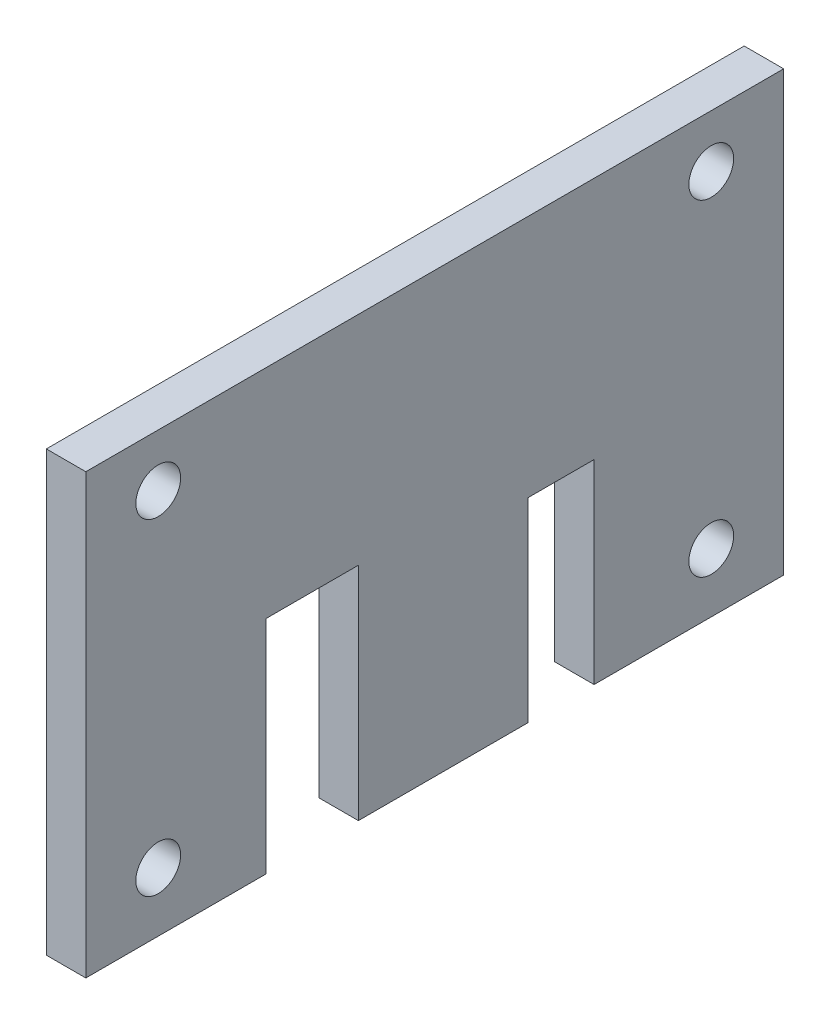
ISO-10303-21;
HEADER;
FILE_DESCRIPTION(('STEP AP214'),'2;1');
FILE_NAME('part.step','',(''),(''),'','','');
FILE_SCHEMA(('AUTOMOTIVE_DESIGN { 1 0 10303 214 1 1 1 1 }'));
ENDSEC;
DATA;
#1=APPLICATION_CONTEXT('core data for automotive mechanical design processes');
#2=APPLICATION_PROTOCOL_DEFINITION('international standard','automotive_design',2000,#1);
#3=PRODUCT_CONTEXT('',#1,'mechanical');
#4=PRODUCT('Part','Part','',(#3));
#5=PRODUCT_RELATED_PRODUCT_CATEGORY('part','',(#4));
#6=PRODUCT_DEFINITION_FORMATION('','',#4);
#7=PRODUCT_DEFINITION_CONTEXT('part definition',#1,'design');
#8=PRODUCT_DEFINITION('design','',#6,#7);
#9=PRODUCT_DEFINITION_SHAPE('','',#8);
#10=(LENGTH_UNIT() NAMED_UNIT(*) SI_UNIT(.MILLI.,.METRE.));
#11=(NAMED_UNIT(*) PLANE_ANGLE_UNIT() SI_UNIT($,.RADIAN.));
#12=(NAMED_UNIT(*) SI_UNIT($,.STERADIAN.) SOLID_ANGLE_UNIT());
#13=UNCERTAINTY_MEASURE_WITH_UNIT(LENGTH_MEASURE(1.E-05),#10,'distance_accuracy_value','');
#14=(GEOMETRIC_REPRESENTATION_CONTEXT(3) GLOBAL_UNCERTAINTY_ASSIGNED_CONTEXT((#13)) GLOBAL_UNIT_ASSIGNED_CONTEXT((#10,
#11,#12)) REPRESENTATION_CONTEXT('',''));
#15=CARTESIAN_POINT('',(0.,0.,0.));
#16=DIRECTION('',(0.,0.,1.));
#17=DIRECTION('',(1.,0.,0.));
#18=AXIS2_PLACEMENT_3D('',#15,#16,#17);
#19=CARTESIAN_POINT('',(75.4,-26.8,99.5));
#20=DIRECTION('',(0.,1.,0.));
#21=DIRECTION('',(0.,0.,1.));
#22=AXIS2_PLACEMENT_3D('',#19,#20,#21);
#23=PLANE('',#22);
#24=DIRECTION('',(-1.,0.,0.));
#25=VECTOR('',#24,1.);
#26=CARTESIAN_POINT('',(75.4,-26.8,85.8));
#27=LINE('',#26,#25);
#28=CARTESIAN_POINT('',(75.4,-26.8,85.8));
#29=VERTEX_POINT('',#28);
#30=CARTESIAN_POINT('',(72.4,-26.8,85.8));
#31=VERTEX_POINT('',#30);
#32=EDGE_CURVE('E165',#29,#31,#27,.T.);
#33=ORIENTED_EDGE('',*,*,#32,.F.);
#34=DIRECTION('',(0.,0.,-1.));
#35=VECTOR('',#34,1.);
#36=CARTESIAN_POINT('',(75.4,-26.8,99.5));
#37=LINE('',#36,#35);
#38=CARTESIAN_POINT('',(75.4,-26.8,99.5));
#39=VERTEX_POINT('',#38);
#40=EDGE_CURVE('E176',#39,#29,#37,.T.);
#41=ORIENTED_EDGE('',*,*,#40,.F.);
#42=DIRECTION('',(-1.,0.,0.));
#43=VECTOR('',#42,1.);
#44=CARTESIAN_POINT('',(75.4,-26.8,99.5));
#45=LINE('',#44,#43);
#46=CARTESIAN_POINT('',(72.4,-26.8,99.5));
#47=VERTEX_POINT('',#46);
#48=EDGE_CURVE('E201',#39,#47,#45,.T.);
#49=ORIENTED_EDGE('',*,*,#48,.T.);
#50=DIRECTION('',(0.,0.,-1.));
#51=VECTOR('',#50,1.);
#52=CARTESIAN_POINT('',(72.4,-26.8,99.5));
#53=LINE('',#52,#51);
#54=EDGE_CURVE('E186',#47,#31,#53,.T.);
#55=ORIENTED_EDGE('',*,*,#54,.T.);
#56=EDGE_LOOP('',(#33,#41,#49,#55));
#57=FACE_BOUND('',#56,.T.);
#58=ADVANCED_FACE('F39',(#57),#23,.F.);
#59=DIRECTION('',(1.,0.,0.));
#60=VECTOR('',#59,1.);
#61=CARTESIAN_POINT('',(75.4,-26.8,78.8));
#62=LINE('',#61,#60);
#63=CARTESIAN_POINT('',(72.4,-26.8,78.8));
#64=VERTEX_POINT('',#63);
#65=CARTESIAN_POINT('',(75.4,-26.8,78.8));
#66=VERTEX_POINT('',#65);
#67=EDGE_CURVE('E156',#64,#66,#62,.T.);
#68=ORIENTED_EDGE('',*,*,#67,.F.);
#69=CARTESIAN_POINT('',(72.4,-26.8,65.9));
#70=VERTEX_POINT('',#69);
#71=EDGE_CURVE('E190',#64,#70,#53,.T.);
#72=ORIENTED_EDGE('',*,*,#71,.T.);
#73=DIRECTION('',(-1.,0.,0.));
#74=VECTOR('',#73,1.);
#75=CARTESIAN_POINT('',(75.4,-26.8,65.9));
#76=LINE('',#75,#74);
#77=CARTESIAN_POINT('',(75.4,-26.8,65.9));
#78=VERTEX_POINT('',#77);
#79=EDGE_CURVE('E153',#78,#70,#76,.T.);
#80=ORIENTED_EDGE('',*,*,#79,.F.);
#81=EDGE_CURVE('E151',#66,#78,#37,.T.);
#82=ORIENTED_EDGE('',*,*,#81,.F.);
#83=EDGE_LOOP('',(#68,#72,#80,#82));
#84=FACE_BOUND('',#83,.T.);
#85=ADVANCED_FACE('F276',(#84),#23,.F.);
#86=DIRECTION('',(1.,0.,0.));
#87=VECTOR('',#86,1.);
#88=CARTESIAN_POINT('',(75.4,-26.8,60.9));
#89=LINE('',#88,#87);
#90=CARTESIAN_POINT('',(72.4,-26.8,60.9));
#91=VERTEX_POINT('',#90);
#92=CARTESIAN_POINT('',(75.4,-26.8,60.9));
#93=VERTEX_POINT('',#92);
#94=EDGE_CURVE('E135',#91,#93,#89,.T.);
#95=ORIENTED_EDGE('',*,*,#94,.F.);
#96=CARTESIAN_POINT('',(72.4,-26.8,46.5));
#97=VERTEX_POINT('',#96);
#98=EDGE_CURVE('E185',#91,#97,#53,.T.);
#99=ORIENTED_EDGE('',*,*,#98,.T.);
#100=DIRECTION('',(-1.,0.,0.));
#101=VECTOR('',#100,1.);
#102=CARTESIAN_POINT('',(75.4,-26.8,46.5));
#103=LINE('',#102,#101);
#104=CARTESIAN_POINT('',(75.4,-26.8,46.5));
#105=VERTEX_POINT('',#104);
#106=EDGE_CURVE('E198',#105,#97,#103,.T.);
#107=ORIENTED_EDGE('',*,*,#106,.F.);
#108=EDGE_CURVE('E174',#93,#105,#37,.T.);
#109=ORIENTED_EDGE('',*,*,#108,.F.);
#110=EDGE_LOOP('',(#95,#99,#107,#109));
#111=FACE_BOUND('',#110,.T.);
#112=ADVANCED_FACE('F244',(#111),#23,.F.);
#113=CARTESIAN_POINT('',(75.4,0.,0.));
#114=DIRECTION('',(1.,0.,0.));
#115=DIRECTION('',(0.,0.,-1.));
#116=AXIS2_PLACEMENT_3D('',#113,#114,#115);
#117=PLANE('',#116);
#118=CARTESIAN_POINT('',(75.4,2.5,94.));
#119=DIRECTION('',(1.,0.,0.));
#120=DIRECTION('',(0.,0.,-1.));
#121=AXIS2_PLACEMENT_3D('',#118,#119,#120);
#122=CIRCLE('',#121,1.69999999999999);
#123=CARTESIAN_POINT('',(75.4,2.5,92.3));
#124=VERTEX_POINT('',#123);
#125=EDGE_CURVE('E232',#124,#124,#122,.F.);
#126=ORIENTED_EDGE('',*,*,#125,.T.);
#127=EDGE_LOOP('',(#126));
#128=FACE_BOUND('',#127,.T.);
#129=CARTESIAN_POINT('',(75.4,-22.3,52.));
#130=DIRECTION('',(1.,0.,0.));
#131=DIRECTION('',(0.,0.,-1.));
#132=AXIS2_PLACEMENT_3D('',#129,#130,#131);
#133=CIRCLE('',#132,1.7);
#134=CARTESIAN_POINT('',(75.4,-22.3,50.3));
#135=VERTEX_POINT('',#134);
#136=EDGE_CURVE('E221',#135,#135,#133,.F.);
#137=ORIENTED_EDGE('',*,*,#136,.T.);
#138=EDGE_LOOP('',(#137));
#139=FACE_BOUND('',#138,.T.);
#140=CARTESIAN_POINT('',(75.4,2.5,52.));
#141=DIRECTION('',(1.,0.,0.));
#142=DIRECTION('',(0.,0.,-1.));
#143=AXIS2_PLACEMENT_3D('',#140,#141,#142);
#144=CIRCLE('',#143,1.7);
#145=CARTESIAN_POINT('',(75.4,2.5,50.3));
#146=VERTEX_POINT('',#145);
#147=EDGE_CURVE('E218',#146,#146,#144,.F.);
#148=ORIENTED_EDGE('',*,*,#147,.T.);
#149=EDGE_LOOP('',(#148));
#150=FACE_BOUND('',#149,.T.);
#151=CARTESIAN_POINT('',(75.4,-22.3,94.));
#152=DIRECTION('',(1.,0.,0.));
#153=DIRECTION('',(0.,0.,-1.));
#154=AXIS2_PLACEMENT_3D('',#151,#152,#153);
#155=CIRCLE('',#154,1.69999999999999);
#156=CARTESIAN_POINT('',(75.4,-22.3,92.3));
#157=VERTEX_POINT('',#156);
#158=EDGE_CURVE('E215',#157,#157,#155,.F.);
#159=ORIENTED_EDGE('',*,*,#158,.T.);
#160=EDGE_LOOP('',(#159));
#161=FACE_BOUND('',#160,.T.);
#162=ORIENTED_EDGE('',*,*,#40,.T.);
#163=DIRECTION('',(0.,1.,0.));
#164=VECTOR('',#163,1.);
#165=CARTESIAN_POINT('',(75.4,0.,85.8));
#166=LINE('',#165,#164);
#167=CARTESIAN_POINT('',(75.4,-10.,85.8));
#168=VERTEX_POINT('',#167);
#169=EDGE_CURVE('E167',#29,#168,#166,.T.);
#170=ORIENTED_EDGE('',*,*,#169,.T.);
#171=DIRECTION('',(0.,0.,-1.));
#172=VECTOR('',#171,1.);
#173=CARTESIAN_POINT('',(75.4,-10.,0.));
#174=LINE('',#173,#172);
#175=CARTESIAN_POINT('',(75.4,-10.,78.8));
#176=VERTEX_POINT('',#175);
#177=EDGE_CURVE('E152',#168,#176,#174,.T.);
#178=ORIENTED_EDGE('',*,*,#177,.T.);
#179=DIRECTION('',(0.,-1.,0.));
#180=VECTOR('',#179,1.);
#181=CARTESIAN_POINT('',(75.4,0.,78.8));
#182=LINE('',#181,#180);
#183=EDGE_CURVE('E163',#176,#66,#182,.T.);
#184=ORIENTED_EDGE('',*,*,#183,.T.);
#185=ORIENTED_EDGE('',*,*,#81,.T.);
#186=DIRECTION('',(0.,1.,0.));
#187=VECTOR('',#186,1.);
#188=CARTESIAN_POINT('',(75.4,0.,65.9));
#189=LINE('',#188,#187);
#190=CARTESIAN_POINT('',(75.4,-12.,65.9));
#191=VERTEX_POINT('',#190);
#192=EDGE_CURVE('E140',#78,#191,#189,.T.);
#193=ORIENTED_EDGE('',*,*,#192,.T.);
#194=DIRECTION('',(0.,0.,-1.));
#195=VECTOR('',#194,1.);
#196=CARTESIAN_POINT('',(75.4,-12.,0.));
#197=LINE('',#196,#195);
#198=CARTESIAN_POINT('',(75.4,-12.,60.9));
#199=VERTEX_POINT('',#198);
#200=EDGE_CURVE('E128',#191,#199,#197,.T.);
#201=ORIENTED_EDGE('',*,*,#200,.T.);
#202=DIRECTION('',(0.,-1.,0.));
#203=VECTOR('',#202,1.);
#204=CARTESIAN_POINT('',(75.4,0.,60.9));
#205=LINE('',#204,#203);
#206=EDGE_CURVE('E158',#199,#93,#205,.T.);
#207=ORIENTED_EDGE('',*,*,#206,.T.);
#208=ORIENTED_EDGE('',*,*,#108,.T.);
#209=DIRECTION('',(0.,1.,0.));
#210=VECTOR('',#209,1.);
#211=CARTESIAN_POINT('',(75.4,-26.8,46.5));
#212=LINE('',#211,#210);
#213=CARTESIAN_POINT('',(75.4,6.5,46.5));
#214=VERTEX_POINT('',#213);
#215=EDGE_CURVE('E178',#105,#214,#212,.T.);
#216=ORIENTED_EDGE('',*,*,#215,.T.);
#217=DIRECTION('',(0.,0.,1.));
#218=VECTOR('',#217,1.);
#219=CARTESIAN_POINT('',(75.4,6.5,46.5));
#220=LINE('',#219,#218);
#221=CARTESIAN_POINT('',(75.4,6.5,99.5));
#222=VERTEX_POINT('',#221);
#223=EDGE_CURVE('E180',#214,#222,#220,.T.);
#224=ORIENTED_EDGE('',*,*,#223,.T.);
#225=DIRECTION('',(0.,-1.,0.));
#226=VECTOR('',#225,1.);
#227=CARTESIAN_POINT('',(75.4,6.5,99.5));
#228=LINE('',#227,#226);
#229=EDGE_CURVE('E171',#222,#39,#228,.T.);
#230=ORIENTED_EDGE('',*,*,#229,.T.);
#231=EDGE_LOOP('',(#162,#170,#178,#184,#185,#193,#201,#207,#208,#216,#224,#230));
#232=FACE_BOUND('',#231,.T.);
#233=ADVANCED_FACE('F148',(#128,#139,#150,#161,#232),#117,.T.);
#234=CARTESIAN_POINT('',(72.4,0.,0.));
#235=DIRECTION('',(1.,0.,0.));
#236=DIRECTION('',(0.,0.,-1.));
#237=AXIS2_PLACEMENT_3D('',#234,#235,#236);
#238=PLANE('',#237);
#239=CARTESIAN_POINT('',(72.4,2.5,94.));
#240=DIRECTION('',(1.,0.,0.));
#241=DIRECTION('',(0.,0.,-1.));
#242=AXIS2_PLACEMENT_3D('',#239,#240,#241);
#243=CIRCLE('',#242,1.69999999999999);
#244=CARTESIAN_POINT('',(72.4,2.5,92.3));
#245=VERTEX_POINT('',#244);
#246=EDGE_CURVE('E43',#245,#245,#243,.F.);
#247=ORIENTED_EDGE('',*,*,#246,.F.);
#248=EDGE_LOOP('',(#247));
#249=FACE_BOUND('',#248,.T.);
#250=CARTESIAN_POINT('',(72.4,-22.3,52.));
#251=DIRECTION('',(1.,0.,0.));
#252=DIRECTION('',(0.,0.,-1.));
#253=AXIS2_PLACEMENT_3D('',#250,#251,#252);
#254=CIRCLE('',#253,1.7);
#255=CARTESIAN_POINT('',(72.4,-22.3,50.3));
#256=VERTEX_POINT('',#255);
#257=EDGE_CURVE('E219',#256,#256,#254,.F.);
#258=ORIENTED_EDGE('',*,*,#257,.F.);
#259=EDGE_LOOP('',(#258));
#260=FACE_BOUND('',#259,.T.);
#261=CARTESIAN_POINT('',(72.4,2.5,52.));
#262=DIRECTION('',(1.,0.,0.));
#263=DIRECTION('',(0.,0.,-1.));
#264=AXIS2_PLACEMENT_3D('',#261,#262,#263);
#265=CIRCLE('',#264,1.7);
#266=CARTESIAN_POINT('',(72.4,2.5,50.3));
#267=VERTEX_POINT('',#266);
#268=EDGE_CURVE('E216',#267,#267,#265,.F.);
#269=ORIENTED_EDGE('',*,*,#268,.F.);
#270=EDGE_LOOP('',(#269));
#271=FACE_BOUND('',#270,.T.);
#272=CARTESIAN_POINT('',(72.4,-22.3,94.));
#273=DIRECTION('',(1.,0.,0.));
#274=DIRECTION('',(0.,0.,-1.));
#275=AXIS2_PLACEMENT_3D('',#272,#273,#274);
#276=CIRCLE('',#275,1.69999999999999);
#277=CARTESIAN_POINT('',(72.4,-22.3,92.3));
#278=VERTEX_POINT('',#277);
#279=EDGE_CURVE('E212',#278,#278,#276,.F.);
#280=ORIENTED_EDGE('',*,*,#279,.F.);
#281=EDGE_LOOP('',(#280));
#282=FACE_BOUND('',#281,.T.);
#283=DIRECTION('',(0.,1.,0.));
#284=VECTOR('',#283,1.);
#285=CARTESIAN_POINT('',(72.4,0.,85.8));
#286=LINE('',#285,#284);
#287=CARTESIAN_POINT('',(72.4,-10.,85.8));
#288=VERTEX_POINT('',#287);
#289=EDGE_CURVE('E11',#31,#288,#286,.T.);
#290=ORIENTED_EDGE('',*,*,#289,.F.);
#291=ORIENTED_EDGE('',*,*,#54,.F.);
#292=DIRECTION('',(0.,-1.,0.));
#293=VECTOR('',#292,1.);
#294=CARTESIAN_POINT('',(72.4,6.5,99.5));
#295=LINE('',#294,#293);
#296=CARTESIAN_POINT('',(72.4,6.5,99.5));
#297=VERTEX_POINT('',#296);
#298=EDGE_CURVE('E170',#297,#47,#295,.T.);
#299=ORIENTED_EDGE('',*,*,#298,.F.);
#300=DIRECTION('',(0.,0.,1.));
#301=VECTOR('',#300,1.);
#302=CARTESIAN_POINT('',(72.4,6.5,46.5));
#303=LINE('',#302,#301);
#304=CARTESIAN_POINT('',(72.4,6.5,46.5));
#305=VERTEX_POINT('',#304);
#306=EDGE_CURVE('E175',#305,#297,#303,.T.);
#307=ORIENTED_EDGE('',*,*,#306,.F.);
#308=DIRECTION('',(0.,1.,0.));
#309=VECTOR('',#308,1.);
#310=CARTESIAN_POINT('',(72.4,-26.8,46.5));
#311=LINE('',#310,#309);
#312=EDGE_CURVE('E189',#97,#305,#311,.T.);
#313=ORIENTED_EDGE('',*,*,#312,.F.);
#314=ORIENTED_EDGE('',*,*,#98,.F.);
#315=DIRECTION('',(0.,-1.,0.));
#316=VECTOR('',#315,1.);
#317=CARTESIAN_POINT('',(72.4,0.,60.9));
#318=LINE('',#317,#316);
#319=CARTESIAN_POINT('',(72.4,-12.,60.9));
#320=VERTEX_POINT('',#319);
#321=EDGE_CURVE('E206',#320,#91,#318,.T.);
#322=ORIENTED_EDGE('',*,*,#321,.F.);
#323=DIRECTION('',(0.,0.,-1.));
#324=VECTOR('',#323,1.);
#325=CARTESIAN_POINT('',(72.4,-12.,0.));
#326=LINE('',#325,#324);
#327=CARTESIAN_POINT('',(72.4,-12.,65.9));
#328=VERTEX_POINT('',#327);
#329=EDGE_CURVE('E204',#328,#320,#326,.T.);
#330=ORIENTED_EDGE('',*,*,#329,.F.);
#331=DIRECTION('',(0.,1.,0.));
#332=VECTOR('',#331,1.);
#333=CARTESIAN_POINT('',(72.4,0.,65.9));
#334=LINE('',#333,#332);
#335=EDGE_CURVE('E143',#70,#328,#334,.T.);
#336=ORIENTED_EDGE('',*,*,#335,.F.);
#337=ORIENTED_EDGE('',*,*,#71,.F.);
#338=DIRECTION('',(0.,-1.,0.));
#339=VECTOR('',#338,1.);
#340=CARTESIAN_POINT('',(72.4,0.,78.8));
#341=LINE('',#340,#339);
#342=CARTESIAN_POINT('',(72.4,-10.,78.8));
#343=VERTEX_POINT('',#342);
#344=EDGE_CURVE('E48',#343,#64,#341,.T.);
#345=ORIENTED_EDGE('',*,*,#344,.F.);
#346=DIRECTION('',(0.,0.,-1.));
#347=VECTOR('',#346,1.);
#348=CARTESIAN_POINT('',(72.4,-10.,0.));
#349=LINE('',#348,#347);
#350=EDGE_CURVE('E209',#288,#343,#349,.T.);
#351=ORIENTED_EDGE('',*,*,#350,.F.);
#352=EDGE_LOOP('',(#290,#291,#299,#307,#313,#314,#322,#330,#336,#337,#345,#351));
#353=FACE_BOUND('',#352,.T.);
#354=ADVANCED_FACE('F268',(#249,#260,#271,#282,#353),#238,.F.);
#355=CARTESIAN_POINT('',(75.4,6.5,99.5));
#356=DIRECTION('',(0.,0.,-1.));
#357=DIRECTION('',(-1.,0.,0.));
#358=AXIS2_PLACEMENT_3D('',#355,#356,#357);
#359=PLANE('',#358);
#360=ORIENTED_EDGE('',*,*,#298,.T.);
#361=ORIENTED_EDGE('',*,*,#48,.F.);
#362=ORIENTED_EDGE('',*,*,#229,.F.);
#363=DIRECTION('',(-1.,0.,0.));
#364=VECTOR('',#363,1.);
#365=CARTESIAN_POINT('',(75.4,6.5,99.5));
#366=LINE('',#365,#364);
#367=EDGE_CURVE('E182',#222,#297,#366,.T.);
#368=ORIENTED_EDGE('',*,*,#367,.T.);
#369=EDGE_LOOP('',(#360,#361,#362,#368));
#370=FACE_BOUND('',#369,.T.);
#371=ADVANCED_FACE('F41',(#370),#359,.F.);
#372=CARTESIAN_POINT('',(75.4,-26.8,46.5));
#373=DIRECTION('',(0.,0.,1.));
#374=DIRECTION('',(1.,0.,0.));
#375=AXIS2_PLACEMENT_3D('',#372,#373,#374);
#376=PLANE('',#375);
#377=ORIENTED_EDGE('',*,*,#312,.T.);
#378=DIRECTION('',(-1.,0.,0.));
#379=VECTOR('',#378,1.);
#380=CARTESIAN_POINT('',(75.4,6.5,46.5));
#381=LINE('',#380,#379);
#382=EDGE_CURVE('E195',#214,#305,#381,.T.);
#383=ORIENTED_EDGE('',*,*,#382,.F.);
#384=ORIENTED_EDGE('',*,*,#215,.F.);
#385=ORIENTED_EDGE('',*,*,#106,.T.);
#386=EDGE_LOOP('',(#377,#383,#384,#385));
#387=FACE_BOUND('',#386,.T.);
#388=ADVANCED_FACE('F250',(#387),#376,.F.);
#389=CARTESIAN_POINT('',(75.4,6.5,46.5));
#390=DIRECTION('',(0.,-1.,0.));
#391=DIRECTION('',(0.,0.,-1.));
#392=AXIS2_PLACEMENT_3D('',#389,#390,#391);
#393=PLANE('',#392);
#394=ORIENTED_EDGE('',*,*,#306,.T.);
#395=ORIENTED_EDGE('',*,*,#367,.F.);
#396=ORIENTED_EDGE('',*,*,#223,.F.);
#397=ORIENTED_EDGE('',*,*,#382,.T.);
#398=EDGE_LOOP('',(#394,#395,#396,#397));
#399=FACE_BOUND('',#398,.T.);
#400=ADVANCED_FACE('F256',(#399),#393,.F.);
#401=CARTESIAN_POINT('',(76.4,-12.,60.9));
#402=DIRECTION('',(0.,-1.,0.));
#403=DIRECTION('',(0.,0.,-1.));
#404=AXIS2_PLACEMENT_3D('',#401,#402,#403);
#405=PLANE('',#404);
#406=DIRECTION('',(-1.,0.,0.));
#407=VECTOR('',#406,1.);
#408=CARTESIAN_POINT('',(76.4,-12.,65.9));
#409=LINE('',#408,#407);
#410=EDGE_CURVE('E63',#191,#328,#409,.T.);
#411=ORIENTED_EDGE('',*,*,#410,.T.);
#412=ORIENTED_EDGE('',*,*,#329,.T.);
#413=DIRECTION('',(-1.,0.,0.));
#414=VECTOR('',#413,1.);
#415=CARTESIAN_POINT('',(76.4,-12.,60.9));
#416=LINE('',#415,#414);
#417=EDGE_CURVE('E131',#199,#320,#416,.T.);
#418=ORIENTED_EDGE('',*,*,#417,.F.);
#419=ORIENTED_EDGE('',*,*,#200,.F.);
#420=EDGE_LOOP('',(#411,#412,#418,#419));
#421=FACE_BOUND('',#420,.T.);
#422=ADVANCED_FACE('F129',(#421),#405,.T.);
#423=CARTESIAN_POINT('',(76.4,-12.,65.9));
#424=DIRECTION('',(0.,0.,-1.));
#425=DIRECTION('',(-1.,0.,0.));
#426=AXIS2_PLACEMENT_3D('',#423,#424,#425);
#427=PLANE('',#426);
#428=ORIENTED_EDGE('',*,*,#79,.T.);
#429=ORIENTED_EDGE('',*,*,#335,.T.);
#430=ORIENTED_EDGE('',*,*,#410,.F.);
#431=ORIENTED_EDGE('',*,*,#192,.F.);
#432=EDGE_LOOP('',(#428,#429,#430,#431));
#433=FACE_BOUND('',#432,.T.);
#434=ADVANCED_FACE('F139',(#433),#427,.T.);
#435=CARTESIAN_POINT('',(76.4,-27.8,60.9));
#436=DIRECTION('',(0.,0.,1.));
#437=DIRECTION('',(1.,0.,0.));
#438=AXIS2_PLACEMENT_3D('',#435,#436,#437);
#439=PLANE('',#438);
#440=ORIENTED_EDGE('',*,*,#417,.T.);
#441=ORIENTED_EDGE('',*,*,#321,.T.);
#442=ORIENTED_EDGE('',*,*,#94,.T.);
#443=ORIENTED_EDGE('',*,*,#206,.F.);
#444=EDGE_LOOP('',(#440,#441,#442,#443));
#445=FACE_BOUND('',#444,.T.);
#446=ADVANCED_FACE('F279',(#445),#439,.T.);
#447=CARTESIAN_POINT('',(76.4,-10.,78.8));
#448=DIRECTION('',(0.,-1.,0.));
#449=DIRECTION('',(0.,0.,-1.));
#450=AXIS2_PLACEMENT_3D('',#447,#448,#449);
#451=PLANE('',#450);
#452=DIRECTION('',(-1.,0.,0.));
#453=VECTOR('',#452,1.);
#454=CARTESIAN_POINT('',(76.4,-10.,85.8));
#455=LINE('',#454,#453);
#456=EDGE_CURVE('E56',#168,#288,#455,.T.);
#457=ORIENTED_EDGE('',*,*,#456,.T.);
#458=ORIENTED_EDGE('',*,*,#350,.T.);
#459=DIRECTION('',(-1.,0.,0.));
#460=VECTOR('',#459,1.);
#461=CARTESIAN_POINT('',(76.4,-10.,78.8));
#462=LINE('',#461,#460);
#463=EDGE_CURVE('E136',#176,#343,#462,.T.);
#464=ORIENTED_EDGE('',*,*,#463,.F.);
#465=ORIENTED_EDGE('',*,*,#177,.F.);
#466=EDGE_LOOP('',(#457,#458,#464,#465));
#467=FACE_BOUND('',#466,.T.);
#468=ADVANCED_FACE('F271',(#467),#451,.T.);
#469=CARTESIAN_POINT('',(76.4,-10.,85.8));
#470=DIRECTION('',(0.,0.,-1.));
#471=DIRECTION('',(-1.,0.,0.));
#472=AXIS2_PLACEMENT_3D('',#469,#470,#471);
#473=PLANE('',#472);
#474=ORIENTED_EDGE('',*,*,#32,.T.);
#475=ORIENTED_EDGE('',*,*,#289,.T.);
#476=ORIENTED_EDGE('',*,*,#456,.F.);
#477=ORIENTED_EDGE('',*,*,#169,.F.);
#478=EDGE_LOOP('',(#474,#475,#476,#477));
#479=FACE_BOUND('',#478,.T.);
#480=ADVANCED_FACE('F263',(#479),#473,.T.);
#481=CARTESIAN_POINT('',(76.4,-27.8,78.8));
#482=DIRECTION('',(0.,0.,1.));
#483=DIRECTION('',(1.,0.,0.));
#484=AXIS2_PLACEMENT_3D('',#481,#482,#483);
#485=PLANE('',#484);
#486=ORIENTED_EDGE('',*,*,#463,.T.);
#487=ORIENTED_EDGE('',*,*,#344,.T.);
#488=ORIENTED_EDGE('',*,*,#67,.T.);
#489=ORIENTED_EDGE('',*,*,#183,.F.);
#490=EDGE_LOOP('',(#486,#487,#488,#489));
#491=FACE_BOUND('',#490,.T.);
#492=ADVANCED_FACE('F273',(#491),#485,.T.);
#493=CARTESIAN_POINT('',(76.4,-22.3,94.));
#494=DIRECTION('',(-1.,0.,0.));
#495=DIRECTION('',(0.,0.,1.));
#496=AXIS2_PLACEMENT_3D('',#493,#494,#495);
#497=CYLINDRICAL_SURFACE('',#496,1.69999999999999);
#498=ORIENTED_EDGE('',*,*,#158,.F.);
#499=EDGE_LOOP('',(#498));
#500=FACE_BOUND('',#499,.T.);
#501=ORIENTED_EDGE('',*,*,#279,.T.);
#502=EDGE_LOOP('',(#501));
#503=FACE_BOUND('',#502,.T.);
#504=ADVANCED_FACE('F390',(#500,#503),#497,.F.);
#505=CARTESIAN_POINT('',(76.4,2.5,52.));
#506=DIRECTION('',(-1.,0.,0.));
#507=DIRECTION('',(0.,0.,1.));
#508=AXIS2_PLACEMENT_3D('',#505,#506,#507);
#509=CYLINDRICAL_SURFACE('',#508,1.7);
#510=ORIENTED_EDGE('',*,*,#147,.F.);
#511=EDGE_LOOP('',(#510));
#512=FACE_BOUND('',#511,.T.);
#513=ORIENTED_EDGE('',*,*,#268,.T.);
#514=EDGE_LOOP('',(#513));
#515=FACE_BOUND('',#514,.T.);
#516=ADVANCED_FACE('F398',(#512,#515),#509,.F.);
#517=CARTESIAN_POINT('',(76.4,-22.3,52.));
#518=DIRECTION('',(-1.,0.,0.));
#519=DIRECTION('',(0.,0.,1.));
#520=AXIS2_PLACEMENT_3D('',#517,#518,#519);
#521=CYLINDRICAL_SURFACE('',#520,1.7);
#522=ORIENTED_EDGE('',*,*,#136,.F.);
#523=EDGE_LOOP('',(#522));
#524=FACE_BOUND('',#523,.T.);
#525=ORIENTED_EDGE('',*,*,#257,.T.);
#526=EDGE_LOOP('',(#525));
#527=FACE_BOUND('',#526,.T.);
#528=ADVANCED_FACE('F408',(#524,#527),#521,.F.);
#529=CARTESIAN_POINT('',(76.4,2.5,94.));
#530=DIRECTION('',(-1.,0.,0.));
#531=DIRECTION('',(0.,0.,1.));
#532=AXIS2_PLACEMENT_3D('',#529,#530,#531);
#533=CYLINDRICAL_SURFACE('',#532,1.69999999999999);
#534=ORIENTED_EDGE('',*,*,#125,.F.);
#535=EDGE_LOOP('',(#534));
#536=FACE_BOUND('',#535,.T.);
#537=ORIENTED_EDGE('',*,*,#246,.T.);
#538=EDGE_LOOP('',(#537));
#539=FACE_BOUND('',#538,.T.);
#540=ADVANCED_FACE('F418',(#536,#539),#533,.F.);
#541=CLOSED_SHELL('',(#58,#85,#112,#233,#354,#371,#388,#400,#422,#434,#446,#468,#480,#492,#504,
#516,#528,#540));
#542=MANIFOLD_SOLID_BREP('B2',#541);
#543=ADVANCED_BREP_SHAPE_REPRESENTATION('',(#18,#542),#14);
#544=SHAPE_DEFINITION_REPRESENTATION(#9,#543);
ENDSEC;
END-ISO-10303-21;
